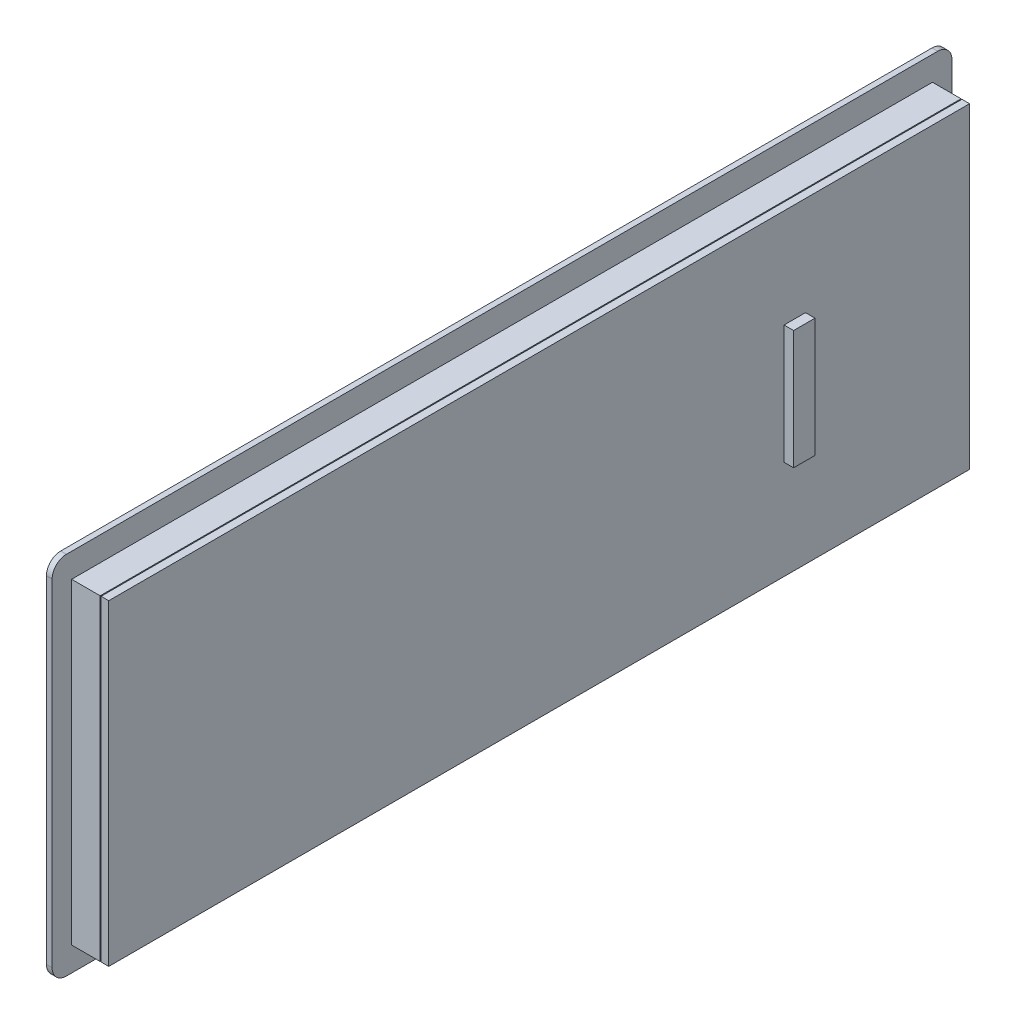
ISO-10303-21;
HEADER;
FILE_DESCRIPTION(('STEP AP214'),'2;1');
FILE_NAME('part.step','',(''),(''),'','','');
FILE_SCHEMA(('AUTOMOTIVE_DESIGN { 1 0 10303 214 1 1 1 1 }'));
ENDSEC;
DATA;
#1=APPLICATION_CONTEXT('core data for automotive mechanical design processes');
#2=APPLICATION_PROTOCOL_DEFINITION('international standard','automotive_design',2000,#1);
#3=PRODUCT_CONTEXT('',#1,'mechanical');
#4=PRODUCT('Part','Part','',(#3));
#5=PRODUCT_RELATED_PRODUCT_CATEGORY('part','',(#4));
#6=PRODUCT_DEFINITION_FORMATION('','',#4);
#7=PRODUCT_DEFINITION_CONTEXT('part definition',#1,'design');
#8=PRODUCT_DEFINITION('design','',#6,#7);
#9=PRODUCT_DEFINITION_SHAPE('','',#8);
#10=(LENGTH_UNIT() NAMED_UNIT(*) SI_UNIT(.MILLI.,.METRE.));
#11=(NAMED_UNIT(*) PLANE_ANGLE_UNIT() SI_UNIT($,.RADIAN.));
#12=(NAMED_UNIT(*) SI_UNIT($,.STERADIAN.) SOLID_ANGLE_UNIT());
#13=UNCERTAINTY_MEASURE_WITH_UNIT(LENGTH_MEASURE(1.E-05),#10,'distance_accuracy_value','');
#14=(GEOMETRIC_REPRESENTATION_CONTEXT(3) GLOBAL_UNCERTAINTY_ASSIGNED_CONTEXT((#13)) GLOBAL_UNIT_ASSIGNED_CONTEXT((#10,
#11,#12)) REPRESENTATION_CONTEXT('',''));
#15=CARTESIAN_POINT('',(0.,0.,0.));
#16=DIRECTION('',(0.,0.,1.));
#17=DIRECTION('',(1.,0.,0.));
#18=AXIS2_PLACEMENT_3D('',#15,#16,#17);
#19=CARTESIAN_POINT('',(9.,0.,0.));
#20=DIRECTION('',(1.,0.,0.));
#21=DIRECTION('',(0.,0.,-1.));
#22=AXIS2_PLACEMENT_3D('',#19,#20,#21);
#23=PLANE('',#22);
#24=DIRECTION('',(0.,-1.,0.));
#25=VECTOR('',#24,1.);
#26=CARTESIAN_POINT('',(9.,33.3,90.4999999999999));
#27=LINE('',#26,#25);
#28=CARTESIAN_POINT('',(9.,33.3,90.4999999999999));
#29=VERTEX_POINT('',#28);
#30=CARTESIAN_POINT('',(9.,-33.3,90.4999999999999));
#31=VERTEX_POINT('',#30);
#32=EDGE_CURVE('E287',#29,#31,#27,.T.);
#33=ORIENTED_EDGE('',*,*,#32,.T.);
#34=DIRECTION('',(0.,0.,-1.));
#35=VECTOR('',#34,1.);
#36=CARTESIAN_POINT('',(9.,-33.3,90.4999999999999));
#37=LINE('',#36,#35);
#38=CARTESIAN_POINT('',(9.,-33.3,-90.5));
#39=VERTEX_POINT('',#38);
#40=EDGE_CURVE('E290',#31,#39,#37,.T.);
#41=ORIENTED_EDGE('',*,*,#40,.T.);
#42=DIRECTION('',(0.,1.,0.));
#43=VECTOR('',#42,1.);
#44=CARTESIAN_POINT('',(9.,33.3,-90.5));
#45=LINE('',#44,#43);
#46=CARTESIAN_POINT('',(9.,33.3,-90.5));
#47=VERTEX_POINT('',#46);
#48=EDGE_CURVE('E293',#39,#47,#45,.T.);
#49=ORIENTED_EDGE('',*,*,#48,.T.);
#50=DIRECTION('',(0.,0.,1.));
#51=VECTOR('',#50,1.);
#52=CARTESIAN_POINT('',(9.,33.3,90.4999999999999));
#53=LINE('',#52,#51);
#54=EDGE_CURVE('E295',#47,#29,#53,.T.);
#55=ORIENTED_EDGE('',*,*,#54,.T.);
#56=EDGE_LOOP('',(#33,#41,#49,#55));
#57=FACE_BOUND('',#56,.T.);
#58=DIRECTION('',(0.,0.,-1.));
#59=VECTOR('',#58,1.);
#60=CARTESIAN_POINT('',(9.,-12.5,-51.5));
#61=LINE('',#60,#59);
#62=CARTESIAN_POINT('',(9.,-12.5,-51.5));
#63=VERTEX_POINT('',#62);
#64=CARTESIAN_POINT('',(9.,-12.5,-56.));
#65=VERTEX_POINT('',#64);
#66=EDGE_CURVE('E970',#63,#65,#61,.T.);
#67=ORIENTED_EDGE('',*,*,#66,.F.);
#68=DIRECTION('',(0.,-1.,0.));
#69=VECTOR('',#68,1.);
#70=CARTESIAN_POINT('',(9.,12.5,-51.5));
#71=LINE('',#70,#69);
#72=CARTESIAN_POINT('',(9.,12.5,-51.5));
#73=VERTEX_POINT('',#72);
#74=EDGE_CURVE('E250',#73,#63,#71,.T.);
#75=ORIENTED_EDGE('',*,*,#74,.F.);
#76=DIRECTION('',(0.,0.,1.));
#77=VECTOR('',#76,1.);
#78=CARTESIAN_POINT('',(9.,12.5,-51.5));
#79=LINE('',#78,#77);
#80=CARTESIAN_POINT('',(9.,12.5,-56.));
#81=VERTEX_POINT('',#80);
#82=EDGE_CURVE('E246',#81,#73,#79,.T.);
#83=ORIENTED_EDGE('',*,*,#82,.F.);
#84=DIRECTION('',(0.,1.,0.));
#85=VECTOR('',#84,1.);
#86=CARTESIAN_POINT('',(9.,12.5,-56.));
#87=LINE('',#86,#85);
#88=EDGE_CURVE('E967',#65,#81,#87,.T.);
#89=ORIENTED_EDGE('',*,*,#88,.F.);
#90=EDGE_LOOP('',(#67,#75,#83,#89));
#91=FACE_BOUND('',#90,.T.);
#92=ADVANCED_FACE('F42',(#57,#91),#23,.T.);
#93=CARTESIAN_POINT('',(1.2,35.4,91.6));
#94=DIRECTION('',(-1.,0.,0.));
#95=DIRECTION('',(0.,0.,1.));
#96=AXIS2_PLACEMENT_3D('',#93,#94,#95);
#97=CYLINDRICAL_SURFACE('',#96,3.);
#98=CARTESIAN_POINT('',(0.,35.4,91.6));
#99=DIRECTION('',(1.,0.,0.));
#100=DIRECTION('',(0.,0.,-1.));
#101=AXIS2_PLACEMENT_3D('',#98,#99,#100);
#102=CIRCLE('',#101,3.);
#103=CARTESIAN_POINT('',(0.,38.4,91.5999999999999));
#104=VERTEX_POINT('',#103);
#105=CARTESIAN_POINT('',(0.,35.3999999999999,94.6));
#106=VERTEX_POINT('',#105);
#107=EDGE_CURVE('E385',#104,#106,#102,.T.);
#108=ORIENTED_EDGE('',*,*,#107,.T.);
#109=DIRECTION('',(-1.,0.,0.));
#110=VECTOR('',#109,1.);
#111=CARTESIAN_POINT('',(1.2,35.3999999999999,94.6));
#112=LINE('',#111,#110);
#113=CARTESIAN_POINT('',(1.2,35.3999999999999,94.6));
#114=VERTEX_POINT('',#113);
#115=EDGE_CURVE('E11',#114,#106,#112,.T.);
#116=ORIENTED_EDGE('',*,*,#115,.F.);
#117=CARTESIAN_POINT('',(1.2,35.4,91.6));
#118=DIRECTION('',(1.,0.,0.));
#119=DIRECTION('',(0.,0.,-1.));
#120=AXIS2_PLACEMENT_3D('',#117,#118,#119);
#121=CIRCLE('',#120,3.);
#122=CARTESIAN_POINT('',(1.2,38.4,91.5999999999999));
#123=VERTEX_POINT('',#122);
#124=EDGE_CURVE('E386',#123,#114,#121,.T.);
#125=ORIENTED_EDGE('',*,*,#124,.F.);
#126=DIRECTION('',(-1.,0.,0.));
#127=VECTOR('',#126,1.);
#128=CARTESIAN_POINT('',(1.2,38.4,91.5999999999999));
#129=LINE('',#128,#127);
#130=EDGE_CURVE('E404',#123,#104,#129,.T.);
#131=ORIENTED_EDGE('',*,*,#130,.T.);
#132=EDGE_LOOP('',(#108,#116,#125,#131));
#133=FACE_BOUND('',#132,.T.);
#134=ADVANCED_FACE('F44',(#133),#97,.T.);
#135=CARTESIAN_POINT('',(1.2,-35.4,94.6));
#136=DIRECTION('',(0.,0.,-1.));
#137=DIRECTION('',(0.,1.,0.));
#138=AXIS2_PLACEMENT_3D('',#135,#136,#137);
#139=PLANE('',#138);
#140=DIRECTION('',(0.,-1.,0.));
#141=VECTOR('',#140,1.);
#142=CARTESIAN_POINT('',(0.,-35.4,94.6));
#143=LINE('',#142,#141);
#144=CARTESIAN_POINT('',(0.,-35.4,94.6));
#145=VERTEX_POINT('',#144);
#146=EDGE_CURVE('E407',#106,#145,#143,.T.);
#147=ORIENTED_EDGE('',*,*,#146,.T.);
#148=DIRECTION('',(-1.,0.,0.));
#149=VECTOR('',#148,1.);
#150=CARTESIAN_POINT('',(1.2,-35.4,94.6));
#151=LINE('',#150,#149);
#152=CARTESIAN_POINT('',(1.2,-35.4,94.6));
#153=VERTEX_POINT('',#152);
#154=EDGE_CURVE('E50',#153,#145,#151,.T.);
#155=ORIENTED_EDGE('',*,*,#154,.F.);
#156=DIRECTION('',(0.,-1.,0.));
#157=VECTOR('',#156,1.);
#158=CARTESIAN_POINT('',(1.2,-35.4,94.6));
#159=LINE('',#158,#157);
#160=EDGE_CURVE('E389',#114,#153,#159,.T.);
#161=ORIENTED_EDGE('',*,*,#160,.F.);
#162=ORIENTED_EDGE('',*,*,#115,.T.);
#163=EDGE_LOOP('',(#147,#155,#161,#162));
#164=FACE_BOUND('',#163,.T.);
#165=ADVANCED_FACE('F464',(#164),#139,.F.);
#166=CARTESIAN_POINT('',(1.2,-35.4,91.6));
#167=DIRECTION('',(-1.,0.,0.));
#168=DIRECTION('',(0.,0.,1.));
#169=AXIS2_PLACEMENT_3D('',#166,#167,#168);
#170=CYLINDRICAL_SURFACE('',#169,3.);
#171=CARTESIAN_POINT('',(0.,-35.4,91.6));
#172=DIRECTION('',(1.,0.,0.));
#173=DIRECTION('',(0.,0.,1.));
#174=AXIS2_PLACEMENT_3D('',#171,#172,#173);
#175=CIRCLE('',#174,3.);
#176=CARTESIAN_POINT('',(0.,-38.4,91.6));
#177=VERTEX_POINT('',#176);
#178=EDGE_CURVE('E409',#145,#177,#175,.T.);
#179=ORIENTED_EDGE('',*,*,#178,.T.);
#180=DIRECTION('',(-1.,0.,0.));
#181=VECTOR('',#180,1.);
#182=CARTESIAN_POINT('',(1.2,-38.4,91.6));
#183=LINE('',#182,#181);
#184=CARTESIAN_POINT('',(1.2,-38.4,91.6));
#185=VERTEX_POINT('',#184);
#186=EDGE_CURVE('E434',#185,#177,#183,.T.);
#187=ORIENTED_EDGE('',*,*,#186,.F.);
#188=CARTESIAN_POINT('',(1.2,-35.4,91.6));
#189=DIRECTION('',(1.,0.,0.));
#190=DIRECTION('',(0.,0.,1.));
#191=AXIS2_PLACEMENT_3D('',#188,#189,#190);
#192=CIRCLE('',#191,3.);
#193=EDGE_CURVE('E392',#153,#185,#192,.T.);
#194=ORIENTED_EDGE('',*,*,#193,.F.);
#195=ORIENTED_EDGE('',*,*,#154,.T.);
#196=EDGE_LOOP('',(#179,#187,#194,#195));
#197=FACE_BOUND('',#196,.T.);
#198=ADVANCED_FACE('F441',(#197),#170,.T.);
#199=CARTESIAN_POINT('',(1.2,-38.4,-91.6));
#200=DIRECTION('',(0.,1.,0.));
#201=DIRECTION('',(0.,0.,1.));
#202=AXIS2_PLACEMENT_3D('',#199,#200,#201);
#203=PLANE('',#202);
#204=DIRECTION('',(0.,0.,-1.));
#205=VECTOR('',#204,1.);
#206=CARTESIAN_POINT('',(0.,-38.4,-91.6));
#207=LINE('',#206,#205);
#208=CARTESIAN_POINT('',(0.,-38.4,-91.6));
#209=VERTEX_POINT('',#208);
#210=EDGE_CURVE('E411',#177,#209,#207,.T.);
#211=ORIENTED_EDGE('',*,*,#210,.T.);
#212=DIRECTION('',(-1.,0.,0.));
#213=VECTOR('',#212,1.);
#214=CARTESIAN_POINT('',(1.2,-38.4,-91.6));
#215=LINE('',#214,#213);
#216=CARTESIAN_POINT('',(1.2,-38.4,-91.6));
#217=VERTEX_POINT('',#216);
#218=EDGE_CURVE('E431',#217,#209,#215,.T.);
#219=ORIENTED_EDGE('',*,*,#218,.F.);
#220=DIRECTION('',(0.,0.,-1.));
#221=VECTOR('',#220,1.);
#222=CARTESIAN_POINT('',(1.2,-38.4,-91.6));
#223=LINE('',#222,#221);
#224=EDGE_CURVE('E394',#185,#217,#223,.T.);
#225=ORIENTED_EDGE('',*,*,#224,.F.);
#226=ORIENTED_EDGE('',*,*,#186,.T.);
#227=EDGE_LOOP('',(#211,#219,#225,#226));
#228=FACE_BOUND('',#227,.T.);
#229=ADVANCED_FACE('F452',(#228),#203,.F.);
#230=CARTESIAN_POINT('',(1.2,-35.4,-91.6));
#231=DIRECTION('',(-1.,0.,0.));
#232=DIRECTION('',(0.,0.,1.));
#233=AXIS2_PLACEMENT_3D('',#230,#231,#232);
#234=CYLINDRICAL_SURFACE('',#233,3.);
#235=CARTESIAN_POINT('',(0.,-35.4,-91.6));
#236=DIRECTION('',(1.,0.,0.));
#237=DIRECTION('',(0.,0.,-1.));
#238=AXIS2_PLACEMENT_3D('',#235,#236,#237);
#239=CIRCLE('',#238,3.);
#240=CARTESIAN_POINT('',(0.,-35.4,-94.6));
#241=VERTEX_POINT('',#240);
#242=EDGE_CURVE('E413',#209,#241,#239,.T.);
#243=ORIENTED_EDGE('',*,*,#242,.T.);
#244=DIRECTION('',(-1.,0.,0.));
#245=VECTOR('',#244,1.);
#246=CARTESIAN_POINT('',(1.2,-35.4,-94.6));
#247=LINE('',#246,#245);
#248=CARTESIAN_POINT('',(1.2,-35.4,-94.6));
#249=VERTEX_POINT('',#248);
#250=EDGE_CURVE('E428',#249,#241,#247,.T.);
#251=ORIENTED_EDGE('',*,*,#250,.F.);
#252=CARTESIAN_POINT('',(1.2,-35.4,-91.6));
#253=DIRECTION('',(1.,0.,0.));
#254=DIRECTION('',(0.,0.,-1.));
#255=AXIS2_PLACEMENT_3D('',#252,#253,#254);
#256=CIRCLE('',#255,3.);
#257=EDGE_CURVE('E396',#217,#249,#256,.T.);
#258=ORIENTED_EDGE('',*,*,#257,.F.);
#259=ORIENTED_EDGE('',*,*,#218,.T.);
#260=EDGE_LOOP('',(#243,#251,#258,#259));
#261=FACE_BOUND('',#260,.T.);
#262=ADVANCED_FACE('F456',(#261),#234,.T.);
#263=CARTESIAN_POINT('',(1.2,-35.4,-94.6));
#264=DIRECTION('',(0.,0.,1.));
#265=DIRECTION('',(1.,0.,0.));
#266=AXIS2_PLACEMENT_3D('',#263,#264,#265);
#267=PLANE('',#266);
#268=DIRECTION('',(0.,1.,0.));
#269=VECTOR('',#268,1.);
#270=CARTESIAN_POINT('',(0.,-35.4,-94.6));
#271=LINE('',#270,#269);
#272=CARTESIAN_POINT('',(0.,35.4,-94.6));
#273=VERTEX_POINT('',#272);
#274=EDGE_CURVE('E415',#241,#273,#271,.T.);
#275=ORIENTED_EDGE('',*,*,#274,.T.);
#276=DIRECTION('',(-1.,0.,0.));
#277=VECTOR('',#276,1.);
#278=CARTESIAN_POINT('',(1.2,35.4,-94.6));
#279=LINE('',#278,#277);
#280=CARTESIAN_POINT('',(1.2,35.4,-94.6));
#281=VERTEX_POINT('',#280);
#282=EDGE_CURVE('E425',#281,#273,#279,.T.);
#283=ORIENTED_EDGE('',*,*,#282,.F.);
#284=DIRECTION('',(0.,1.,0.));
#285=VECTOR('',#284,1.);
#286=CARTESIAN_POINT('',(1.2,-35.4,-94.6));
#287=LINE('',#286,#285);
#288=EDGE_CURVE('E398',#249,#281,#287,.T.);
#289=ORIENTED_EDGE('',*,*,#288,.F.);
#290=ORIENTED_EDGE('',*,*,#250,.T.);
#291=EDGE_LOOP('',(#275,#283,#289,#290));
#292=FACE_BOUND('',#291,.T.);
#293=ADVANCED_FACE('F477',(#292),#267,.F.);
#294=CARTESIAN_POINT('',(1.2,35.4,-91.6));
#295=DIRECTION('',(-1.,0.,0.));
#296=DIRECTION('',(0.,0.,1.));
#297=AXIS2_PLACEMENT_3D('',#294,#295,#296);
#298=CYLINDRICAL_SURFACE('',#297,3.);
#299=CARTESIAN_POINT('',(0.,35.4,-91.6));
#300=DIRECTION('',(1.,0.,0.));
#301=DIRECTION('',(0.,0.,-1.));
#302=AXIS2_PLACEMENT_3D('',#299,#300,#301);
#303=CIRCLE('',#302,3.);
#304=CARTESIAN_POINT('',(0.,38.4,-91.6));
#305=VERTEX_POINT('',#304);
#306=EDGE_CURVE('E417',#273,#305,#303,.T.);
#307=ORIENTED_EDGE('',*,*,#306,.T.);
#308=DIRECTION('',(-1.,0.,0.));
#309=VECTOR('',#308,1.);
#310=CARTESIAN_POINT('',(1.2,38.4,-91.6));
#311=LINE('',#310,#309);
#312=CARTESIAN_POINT('',(1.2,38.4,-91.6));
#313=VERTEX_POINT('',#312);
#314=EDGE_CURVE('E422',#313,#305,#311,.T.);
#315=ORIENTED_EDGE('',*,*,#314,.F.);
#316=CARTESIAN_POINT('',(1.2,35.4,-91.6));
#317=DIRECTION('',(1.,0.,0.));
#318=DIRECTION('',(0.,0.,-1.));
#319=AXIS2_PLACEMENT_3D('',#316,#317,#318);
#320=CIRCLE('',#319,3.);
#321=EDGE_CURVE('E400',#281,#313,#320,.T.);
#322=ORIENTED_EDGE('',*,*,#321,.F.);
#323=ORIENTED_EDGE('',*,*,#282,.T.);
#324=EDGE_LOOP('',(#307,#315,#322,#323));
#325=FACE_BOUND('',#324,.T.);
#326=ADVANCED_FACE('F475',(#325),#298,.T.);
#327=CARTESIAN_POINT('',(1.2,38.4,-91.6));
#328=DIRECTION('',(0.,-1.,0.));
#329=DIRECTION('',(0.,0.,-1.));
#330=AXIS2_PLACEMENT_3D('',#327,#328,#329);
#331=PLANE('',#330);
#332=DIRECTION('',(0.,0.,1.));
#333=VECTOR('',#332,1.);
#334=CARTESIAN_POINT('',(0.,38.4,-91.6));
#335=LINE('',#334,#333);
#336=EDGE_CURVE('E390',#305,#104,#335,.T.);
#337=ORIENTED_EDGE('',*,*,#336,.T.);
#338=ORIENTED_EDGE('',*,*,#130,.F.);
#339=DIRECTION('',(0.,0.,1.));
#340=VECTOR('',#339,1.);
#341=CARTESIAN_POINT('',(1.2,38.4,-91.6));
#342=LINE('',#341,#340);
#343=EDGE_CURVE('E402',#313,#123,#342,.T.);
#344=ORIENTED_EDGE('',*,*,#343,.F.);
#345=ORIENTED_EDGE('',*,*,#314,.T.);
#346=EDGE_LOOP('',(#337,#338,#344,#345));
#347=FACE_BOUND('',#346,.T.);
#348=ADVANCED_FACE('F470',(#347),#331,.F.);
#349=CARTESIAN_POINT('',(1.2,35.4,91.6));
#350=DIRECTION('',(1.,0.,0.));
#351=DIRECTION('',(0.,0.,-1.));
#352=AXIS2_PLACEMENT_3D('',#349,#350,#351);
#353=PLANE('',#352);
#354=DIRECTION('',(0.,-1.,0.));
#355=VECTOR('',#354,1.);
#356=CARTESIAN_POINT('',(1.2,33.3,90.4999999999999));
#357=LINE('',#356,#355);
#358=CARTESIAN_POINT('',(1.2,33.3,90.4999999999999));
#359=VERTEX_POINT('',#358);
#360=CARTESIAN_POINT('',(1.2,-33.3,90.4999999999999));
#361=VERTEX_POINT('',#360);
#362=EDGE_CURVE('E352',#359,#361,#357,.T.);
#363=ORIENTED_EDGE('',*,*,#362,.F.);
#364=DIRECTION('',(0.,0.,1.));
#365=VECTOR('',#364,1.);
#366=CARTESIAN_POINT('',(1.2,33.3,90.4999999999999));
#367=LINE('',#366,#365);
#368=CARTESIAN_POINT('',(1.2,33.3,-90.5));
#369=VERTEX_POINT('',#368);
#370=EDGE_CURVE('E357',#369,#359,#367,.T.);
#371=ORIENTED_EDGE('',*,*,#370,.F.);
#372=DIRECTION('',(0.,1.,0.));
#373=VECTOR('',#372,1.);
#374=CARTESIAN_POINT('',(1.2,33.3,-90.5));
#375=LINE('',#374,#373);
#376=CARTESIAN_POINT('',(1.2,-33.3,-90.5));
#377=VERTEX_POINT('',#376);
#378=EDGE_CURVE('E369',#377,#369,#375,.T.);
#379=ORIENTED_EDGE('',*,*,#378,.F.);
#380=DIRECTION('',(0.,0.,-1.));
#381=VECTOR('',#380,1.);
#382=CARTESIAN_POINT('',(1.2,-33.3,90.4999999999999));
#383=LINE('',#382,#381);
#384=EDGE_CURVE('E366',#361,#377,#383,.T.);
#385=ORIENTED_EDGE('',*,*,#384,.F.);
#386=EDGE_LOOP('',(#363,#371,#379,#385));
#387=FACE_BOUND('',#386,.T.);
#388=ORIENTED_EDGE('',*,*,#124,.T.);
#389=ORIENTED_EDGE('',*,*,#160,.T.);
#390=ORIENTED_EDGE('',*,*,#193,.T.);
#391=ORIENTED_EDGE('',*,*,#224,.T.);
#392=ORIENTED_EDGE('',*,*,#257,.T.);
#393=ORIENTED_EDGE('',*,*,#288,.T.);
#394=ORIENTED_EDGE('',*,*,#321,.T.);
#395=ORIENTED_EDGE('',*,*,#343,.T.);
#396=EDGE_LOOP('',(#388,#389,#390,#391,#392,#393,#394,#395));
#397=FACE_BOUND('',#396,.T.);
#398=ADVANCED_FACE('F460',(#387,#397),#353,.T.);
#399=CARTESIAN_POINT('',(0.,35.4,91.6));
#400=DIRECTION('',(1.,0.,0.));
#401=DIRECTION('',(0.,0.,-1.));
#402=AXIS2_PLACEMENT_3D('',#399,#400,#401);
#403=PLANE('',#402);
#404=DIRECTION('',(0.,0.,1.));
#405=VECTOR('',#404,1.);
#406=CARTESIAN_POINT('',(0.,-30.51,-80.7));
#407=LINE('',#406,#405);
#408=CARTESIAN_POINT('',(0.,-30.51,-80.7));
#409=VERTEX_POINT('',#408);
#410=CARTESIAN_POINT('',(0.,-30.51,80.7));
#411=VERTEX_POINT('',#410);
#412=EDGE_CURVE('E253',#409,#411,#407,.T.);
#413=ORIENTED_EDGE('',*,*,#412,.F.);
#414=DIRECTION('',(0.,-1.,0.));
#415=VECTOR('',#414,1.);
#416=CARTESIAN_POINT('',(0.,30.51,-80.7));
#417=LINE('',#416,#415);
#418=CARTESIAN_POINT('',(0.,30.51,-80.7));
#419=VERTEX_POINT('',#418);
#420=EDGE_CURVE('E65',#419,#409,#417,.T.);
#421=ORIENTED_EDGE('',*,*,#420,.F.);
#422=DIRECTION('',(0.,0.,-1.));
#423=VECTOR('',#422,1.);
#424=CARTESIAN_POINT('',(0.,30.51,-80.7));
#425=LINE('',#424,#423);
#426=CARTESIAN_POINT('',(0.,30.51,80.6999999999999));
#427=VERTEX_POINT('',#426);
#428=EDGE_CURVE('E262',#427,#419,#425,.T.);
#429=ORIENTED_EDGE('',*,*,#428,.F.);
#430=DIRECTION('',(0.,1.,0.));
#431=VECTOR('',#430,1.);
#432=CARTESIAN_POINT('',(0.,30.51,80.6999999999999));
#433=LINE('',#432,#431);
#434=EDGE_CURVE('E274',#411,#427,#433,.T.);
#435=ORIENTED_EDGE('',*,*,#434,.F.);
#436=EDGE_LOOP('',(#413,#421,#429,#435));
#437=FACE_BOUND('',#436,.T.);
#438=ORIENTED_EDGE('',*,*,#107,.F.);
#439=ORIENTED_EDGE('',*,*,#336,.F.);
#440=ORIENTED_EDGE('',*,*,#306,.F.);
#441=ORIENTED_EDGE('',*,*,#274,.F.);
#442=ORIENTED_EDGE('',*,*,#242,.F.);
#443=ORIENTED_EDGE('',*,*,#210,.F.);
#444=ORIENTED_EDGE('',*,*,#178,.F.);
#445=ORIENTED_EDGE('',*,*,#146,.F.);
#446=EDGE_LOOP('',(#438,#439,#440,#441,#442,#443,#444,#445));
#447=FACE_BOUND('',#446,.T.);
#448=ADVANCED_FACE('F447',(#437,#447),#403,.F.);
#449=CARTESIAN_POINT('',(7.2,33.3,90.4999999999999));
#450=DIRECTION('',(0.,0.,-1.));
#451=DIRECTION('',(0.,1.,0.));
#452=AXIS2_PLACEMENT_3D('',#449,#450,#451);
#453=PLANE('',#452);
#454=ORIENTED_EDGE('',*,*,#362,.T.);
#455=DIRECTION('',(-1.,0.,0.));
#456=VECTOR('',#455,1.);
#457=CARTESIAN_POINT('',(7.2,-33.3,90.4999999999999));
#458=LINE('',#457,#456);
#459=CARTESIAN_POINT('',(7.2,-33.3,90.4999999999999));
#460=VERTEX_POINT('',#459);
#461=EDGE_CURVE('E382',#460,#361,#458,.T.);
#462=ORIENTED_EDGE('',*,*,#461,.F.);
#463=DIRECTION('',(0.,-1.,0.));
#464=VECTOR('',#463,1.);
#465=CARTESIAN_POINT('',(7.2,33.3,90.4999999999999));
#466=LINE('',#465,#464);
#467=CARTESIAN_POINT('',(7.2,33.3,90.4999999999999));
#468=VERTEX_POINT('',#467);
#469=EDGE_CURVE('E353',#468,#460,#466,.T.);
#470=ORIENTED_EDGE('',*,*,#469,.F.);
#471=DIRECTION('',(-1.,0.,0.));
#472=VECTOR('',#471,1.);
#473=CARTESIAN_POINT('',(7.2,33.3,90.4999999999999));
#474=LINE('',#473,#472);
#475=EDGE_CURVE('E363',#468,#359,#474,.T.);
#476=ORIENTED_EDGE('',*,*,#475,.T.);
#477=EDGE_LOOP('',(#454,#462,#470,#476));
#478=FACE_BOUND('',#477,.T.);
#479=ADVANCED_FACE('F548',(#478),#453,.F.);
#480=CARTESIAN_POINT('',(7.2,-33.3,90.4999999999999));
#481=DIRECTION('',(0.,1.,0.));
#482=DIRECTION('',(0.,0.,1.));
#483=AXIS2_PLACEMENT_3D('',#480,#481,#482);
#484=PLANE('',#483);
#485=ORIENTED_EDGE('',*,*,#384,.T.);
#486=DIRECTION('',(-1.,0.,0.));
#487=VECTOR('',#486,1.);
#488=CARTESIAN_POINT('',(7.2,-33.3,-90.5));
#489=LINE('',#488,#487);
#490=CARTESIAN_POINT('',(7.2,-33.3,-90.5));
#491=VERTEX_POINT('',#490);
#492=EDGE_CURVE('E379',#491,#377,#489,.T.);
#493=ORIENTED_EDGE('',*,*,#492,.F.);
#494=DIRECTION('',(0.,0.,-1.));
#495=VECTOR('',#494,1.);
#496=CARTESIAN_POINT('',(7.2,-33.3,90.4999999999999));
#497=LINE('',#496,#495);
#498=EDGE_CURVE('E356',#460,#491,#497,.T.);
#499=ORIENTED_EDGE('',*,*,#498,.F.);
#500=ORIENTED_EDGE('',*,*,#461,.T.);
#501=EDGE_LOOP('',(#485,#493,#499,#500));
#502=FACE_BOUND('',#501,.T.);
#503=ADVANCED_FACE('F544',(#502),#484,.F.);
#504=CARTESIAN_POINT('',(7.2,33.3,-90.5));
#505=DIRECTION('',(0.,0.,1.));
#506=DIRECTION('',(0.,-1.,0.));
#507=AXIS2_PLACEMENT_3D('',#504,#505,#506);
#508=PLANE('',#507);
#509=ORIENTED_EDGE('',*,*,#378,.T.);
#510=DIRECTION('',(-1.,0.,0.));
#511=VECTOR('',#510,1.);
#512=CARTESIAN_POINT('',(7.2,33.3,-90.5));
#513=LINE('',#512,#511);
#514=CARTESIAN_POINT('',(7.2,33.3,-90.5));
#515=VERTEX_POINT('',#514);
#516=EDGE_CURVE('E376',#515,#369,#513,.T.);
#517=ORIENTED_EDGE('',*,*,#516,.F.);
#518=DIRECTION('',(0.,1.,0.));
#519=VECTOR('',#518,1.);
#520=CARTESIAN_POINT('',(7.2,33.3,-90.5));
#521=LINE('',#520,#519);
#522=EDGE_CURVE('E359',#491,#515,#521,.T.);
#523=ORIENTED_EDGE('',*,*,#522,.F.);
#524=ORIENTED_EDGE('',*,*,#492,.T.);
#525=EDGE_LOOP('',(#509,#517,#523,#524));
#526=FACE_BOUND('',#525,.T.);
#527=ADVANCED_FACE('F540',(#526),#508,.F.);
#528=CARTESIAN_POINT('',(7.2,33.3,90.4999999999999));
#529=DIRECTION('',(0.,-1.,0.));
#530=DIRECTION('',(0.,0.,-1.));
#531=AXIS2_PLACEMENT_3D('',#528,#529,#530);
#532=PLANE('',#531);
#533=ORIENTED_EDGE('',*,*,#370,.T.);
#534=ORIENTED_EDGE('',*,*,#475,.F.);
#535=DIRECTION('',(0.,0.,1.));
#536=VECTOR('',#535,1.);
#537=CARTESIAN_POINT('',(7.2,33.3,90.4999999999999));
#538=LINE('',#537,#536);
#539=EDGE_CURVE('E361',#515,#468,#538,.T.);
#540=ORIENTED_EDGE('',*,*,#539,.F.);
#541=ORIENTED_EDGE('',*,*,#516,.T.);
#542=EDGE_LOOP('',(#533,#534,#540,#541));
#543=FACE_BOUND('',#542,.T.);
#544=ADVANCED_FACE('F536',(#543),#532,.F.);
#545=CARTESIAN_POINT('',(7.2,0.,0.));
#546=DIRECTION('',(1.,0.,0.));
#547=DIRECTION('',(0.,0.,-1.));
#548=AXIS2_PLACEMENT_3D('',#545,#546,#547);
#549=PLANE('',#548);
#550=DIRECTION('',(0.,-1.,0.));
#551=VECTOR('',#550,1.);
#552=CARTESIAN_POINT('',(7.2,30.7998921727304,87.5388419430578));
#553=LINE('',#552,#551);
#554=CARTESIAN_POINT('',(7.2,30.7998921727304,87.5388419430578));
#555=VERTEX_POINT('',#554);
#556=CARTESIAN_POINT('',(7.2,-31.3407820481366,87.5388419430578));
#557=VERTEX_POINT('',#556);
#558=EDGE_CURVE('E316',#555,#557,#553,.T.);
#559=ORIENTED_EDGE('',*,*,#558,.F.);
#560=DIRECTION('',(0.,0.,1.));
#561=VECTOR('',#560,1.);
#562=CARTESIAN_POINT('',(7.2,30.7998921727304,87.5388419430578));
#563=LINE('',#562,#561);
#564=CARTESIAN_POINT('',(7.2,30.7998921727304,-88.4139327939693));
#565=VERTEX_POINT('',#564);
#566=EDGE_CURVE('E321',#565,#555,#563,.T.);
#567=ORIENTED_EDGE('',*,*,#566,.F.);
#568=DIRECTION('',(0.,1.,0.));
#569=VECTOR('',#568,1.);
#570=CARTESIAN_POINT('',(7.2,30.7998921727304,-88.4139327939693));
#571=LINE('',#570,#569);
#572=CARTESIAN_POINT('',(7.2,-31.3407820481366,-88.4139327939693));
#573=VERTEX_POINT('',#572);
#574=EDGE_CURVE('E336',#573,#565,#571,.T.);
#575=ORIENTED_EDGE('',*,*,#574,.F.);
#576=DIRECTION('',(0.,0.,-1.));
#577=VECTOR('',#576,1.);
#578=CARTESIAN_POINT('',(7.2,-31.3407820481366,87.5388419430578));
#579=LINE('',#578,#577);
#580=EDGE_CURVE('E333',#557,#573,#579,.T.);
#581=ORIENTED_EDGE('',*,*,#580,.F.);
#582=EDGE_LOOP('',(#559,#567,#575,#581));
#583=FACE_BOUND('',#582,.T.);
#584=ORIENTED_EDGE('',*,*,#469,.T.);
#585=ORIENTED_EDGE('',*,*,#498,.T.);
#586=ORIENTED_EDGE('',*,*,#522,.T.);
#587=ORIENTED_EDGE('',*,*,#539,.T.);
#588=EDGE_LOOP('',(#584,#585,#586,#587));
#589=FACE_BOUND('',#588,.T.);
#590=ADVANCED_FACE('F532',(#583,#589),#549,.T.);
#591=CARTESIAN_POINT('',(7.4,30.7998921727304,87.5388419430578));
#592=DIRECTION('',(0.,0.,-1.));
#593=DIRECTION('',(-1.,0.,0.));
#594=AXIS2_PLACEMENT_3D('',#591,#592,#593);
#595=PLANE('',#594);
#596=ORIENTED_EDGE('',*,*,#558,.T.);
#597=DIRECTION('',(-1.,0.,0.));
#598=VECTOR('',#597,1.);
#599=CARTESIAN_POINT('',(7.4,-31.3407820481366,87.5388419430578));
#600=LINE('',#599,#598);
#601=CARTESIAN_POINT('',(7.4,-31.3407820481366,87.5388419430578));
#602=VERTEX_POINT('',#601);
#603=EDGE_CURVE('E349',#602,#557,#600,.T.);
#604=ORIENTED_EDGE('',*,*,#603,.F.);
#605=DIRECTION('',(0.,-1.,0.));
#606=VECTOR('',#605,1.);
#607=CARTESIAN_POINT('',(7.4,30.7998921727304,87.5388419430578));
#608=LINE('',#607,#606);
#609=CARTESIAN_POINT('',(7.4,30.7998921727304,87.5388419430578));
#610=VERTEX_POINT('',#609);
#611=EDGE_CURVE('E317',#610,#602,#608,.T.);
#612=ORIENTED_EDGE('',*,*,#611,.F.);
#613=DIRECTION('',(-1.,0.,0.));
#614=VECTOR('',#613,1.);
#615=CARTESIAN_POINT('',(7.4,30.7998921727304,87.5388419430578));
#616=LINE('',#615,#614);
#617=EDGE_CURVE('E330',#610,#555,#616,.T.);
#618=ORIENTED_EDGE('',*,*,#617,.T.);
#619=EDGE_LOOP('',(#596,#604,#612,#618));
#620=FACE_BOUND('',#619,.T.);
#621=ADVANCED_FACE('F528',(#620),#595,.F.);
#622=CARTESIAN_POINT('',(7.4,-31.3407820481366,87.5388419430578));
#623=DIRECTION('',(0.,1.,0.));
#624=DIRECTION('',(0.,0.,1.));
#625=AXIS2_PLACEMENT_3D('',#622,#623,#624);
#626=PLANE('',#625);
#627=ORIENTED_EDGE('',*,*,#580,.T.);
#628=DIRECTION('',(-1.,0.,0.));
#629=VECTOR('',#628,1.);
#630=CARTESIAN_POINT('',(7.4,-31.3407820481366,-88.4139327939693));
#631=LINE('',#630,#629);
#632=CARTESIAN_POINT('',(7.4,-31.3407820481366,-88.4139327939693));
#633=VERTEX_POINT('',#632);
#634=EDGE_CURVE('E346',#633,#573,#631,.T.);
#635=ORIENTED_EDGE('',*,*,#634,.F.);
#636=DIRECTION('',(0.,0.,-1.));
#637=VECTOR('',#636,1.);
#638=CARTESIAN_POINT('',(7.4,-31.3407820481366,87.5388419430578));
#639=LINE('',#638,#637);
#640=EDGE_CURVE('E320',#602,#633,#639,.T.);
#641=ORIENTED_EDGE('',*,*,#640,.F.);
#642=ORIENTED_EDGE('',*,*,#603,.T.);
#643=EDGE_LOOP('',(#627,#635,#641,#642));
#644=FACE_BOUND('',#643,.T.);
#645=ADVANCED_FACE('F524',(#644),#626,.F.);
#646=CARTESIAN_POINT('',(7.4,30.7998921727304,-88.4139327939693));
#647=DIRECTION('',(0.,0.,1.));
#648=DIRECTION('',(1.,0.,0.));
#649=AXIS2_PLACEMENT_3D('',#646,#647,#648);
#650=PLANE('',#649);
#651=ORIENTED_EDGE('',*,*,#574,.T.);
#652=DIRECTION('',(-1.,0.,0.));
#653=VECTOR('',#652,1.);
#654=CARTESIAN_POINT('',(7.4,30.7998921727304,-88.4139327939693));
#655=LINE('',#654,#653);
#656=CARTESIAN_POINT('',(7.4,30.7998921727304,-88.4139327939693));
#657=VERTEX_POINT('',#656);
#658=EDGE_CURVE('E343',#657,#565,#655,.T.);
#659=ORIENTED_EDGE('',*,*,#658,.F.);
#660=DIRECTION('',(0.,1.,0.));
#661=VECTOR('',#660,1.);
#662=CARTESIAN_POINT('',(7.4,30.7998921727304,-88.4139327939693));
#663=LINE('',#662,#661);
#664=EDGE_CURVE('E324',#633,#657,#663,.T.);
#665=ORIENTED_EDGE('',*,*,#664,.F.);
#666=ORIENTED_EDGE('',*,*,#634,.T.);
#667=EDGE_LOOP('',(#651,#659,#665,#666));
#668=FACE_BOUND('',#667,.T.);
#669=ADVANCED_FACE('F520',(#668),#650,.F.);
#670=CARTESIAN_POINT('',(7.4,30.7998921727304,87.5388419430578));
#671=DIRECTION('',(0.,-1.,0.));
#672=DIRECTION('',(0.,0.,-1.));
#673=AXIS2_PLACEMENT_3D('',#670,#671,#672);
#674=PLANE('',#673);
#675=ORIENTED_EDGE('',*,*,#566,.T.);
#676=ORIENTED_EDGE('',*,*,#617,.F.);
#677=DIRECTION('',(0.,0.,1.));
#678=VECTOR('',#677,1.);
#679=CARTESIAN_POINT('',(7.4,30.7998921727304,87.5388419430578));
#680=LINE('',#679,#678);
#681=EDGE_CURVE('E327',#657,#610,#680,.T.);
#682=ORIENTED_EDGE('',*,*,#681,.F.);
#683=ORIENTED_EDGE('',*,*,#658,.T.);
#684=EDGE_LOOP('',(#675,#676,#682,#683));
#685=FACE_BOUND('',#684,.T.);
#686=ADVANCED_FACE('F501',(#685),#674,.F.);
#687=CARTESIAN_POINT('',(7.4,0.,0.));
#688=DIRECTION('',(1.,0.,0.));
#689=DIRECTION('',(0.,0.,-1.));
#690=AXIS2_PLACEMENT_3D('',#687,#688,#689);
#691=PLANE('',#690);
#692=DIRECTION('',(0.,-1.,0.));
#693=VECTOR('',#692,1.);
#694=CARTESIAN_POINT('',(7.4,33.3,90.4999999999999));
#695=LINE('',#694,#693);
#696=CARTESIAN_POINT('',(7.4,33.3,90.4999999999999));
#697=VERTEX_POINT('',#696);
#698=CARTESIAN_POINT('',(7.4,-33.3,90.4999999999999));
#699=VERTEX_POINT('',#698);
#700=EDGE_CURVE('E281',#697,#699,#695,.T.);
#701=ORIENTED_EDGE('',*,*,#700,.F.);
#702=DIRECTION('',(0.,0.,1.));
#703=VECTOR('',#702,1.);
#704=CARTESIAN_POINT('',(7.4,33.3,90.4999999999999));
#705=LINE('',#704,#703);
#706=CARTESIAN_POINT('',(7.4,33.3,-90.5));
#707=VERTEX_POINT('',#706);
#708=EDGE_CURVE('E291',#707,#697,#705,.T.);
#709=ORIENTED_EDGE('',*,*,#708,.F.);
#710=DIRECTION('',(0.,1.,0.));
#711=VECTOR('',#710,1.);
#712=CARTESIAN_POINT('',(7.4,33.3,-90.5));
#713=LINE('',#712,#711);
#714=CARTESIAN_POINT('',(7.4,-33.3,-90.5));
#715=VERTEX_POINT('',#714);
#716=EDGE_CURVE('E302',#715,#707,#713,.T.);
#717=ORIENTED_EDGE('',*,*,#716,.F.);
#718=DIRECTION('',(0.,0.,-1.));
#719=VECTOR('',#718,1.);
#720=CARTESIAN_POINT('',(7.4,-33.3,90.4999999999999));
#721=LINE('',#720,#719);
#722=EDGE_CURVE('E300',#699,#715,#721,.T.);
#723=ORIENTED_EDGE('',*,*,#722,.F.);
#724=EDGE_LOOP('',(#701,#709,#717,#723));
#725=FACE_BOUND('',#724,.T.);
#726=ORIENTED_EDGE('',*,*,#681,.T.);
#727=ORIENTED_EDGE('',*,*,#611,.T.);
#728=ORIENTED_EDGE('',*,*,#640,.T.);
#729=ORIENTED_EDGE('',*,*,#664,.T.);
#730=EDGE_LOOP('',(#726,#727,#728,#729));
#731=FACE_BOUND('',#730,.T.);
#732=ADVANCED_FACE('F497',(#725,#731),#691,.F.);
#733=CARTESIAN_POINT('',(9.,33.3,90.4999999999999));
#734=DIRECTION('',(0.,0.,-1.));
#735=DIRECTION('',(-1.,0.,0.));
#736=AXIS2_PLACEMENT_3D('',#733,#734,#735);
#737=PLANE('',#736);
#738=ORIENTED_EDGE('',*,*,#700,.T.);
#739=DIRECTION('',(-1.,0.,0.));
#740=VECTOR('',#739,1.);
#741=CARTESIAN_POINT('',(9.,-33.3,90.4999999999999));
#742=LINE('',#741,#740);
#743=EDGE_CURVE('E313',#31,#699,#742,.T.);
#744=ORIENTED_EDGE('',*,*,#743,.F.);
#745=ORIENTED_EDGE('',*,*,#32,.F.);
#746=DIRECTION('',(-1.,0.,0.));
#747=VECTOR('',#746,1.);
#748=CARTESIAN_POINT('',(9.,33.3,90.4999999999999));
#749=LINE('',#748,#747);
#750=EDGE_CURVE('E297',#29,#697,#749,.T.);
#751=ORIENTED_EDGE('',*,*,#750,.T.);
#752=EDGE_LOOP('',(#738,#744,#745,#751));
#753=FACE_BOUND('',#752,.T.);
#754=ADVANCED_FACE('F500',(#753),#737,.F.);
#755=CARTESIAN_POINT('',(9.,-33.3,90.4999999999999));
#756=DIRECTION('',(0.,1.,0.));
#757=DIRECTION('',(0.,0.,1.));
#758=AXIS2_PLACEMENT_3D('',#755,#756,#757);
#759=PLANE('',#758);
#760=ORIENTED_EDGE('',*,*,#722,.T.);
#761=DIRECTION('',(-1.,0.,0.));
#762=VECTOR('',#761,1.);
#763=CARTESIAN_POINT('',(9.,-33.3,-90.5));
#764=LINE('',#763,#762);
#765=EDGE_CURVE('E310',#39,#715,#764,.T.);
#766=ORIENTED_EDGE('',*,*,#765,.F.);
#767=ORIENTED_EDGE('',*,*,#40,.F.);
#768=ORIENTED_EDGE('',*,*,#743,.T.);
#769=EDGE_LOOP('',(#760,#766,#767,#768));
#770=FACE_BOUND('',#769,.T.);
#771=ADVANCED_FACE('F510',(#770),#759,.F.);
#772=CARTESIAN_POINT('',(9.,33.3,-90.5));
#773=DIRECTION('',(0.,0.,1.));
#774=DIRECTION('',(1.,0.,0.));
#775=AXIS2_PLACEMENT_3D('',#772,#773,#774);
#776=PLANE('',#775);
#777=ORIENTED_EDGE('',*,*,#716,.T.);
#778=DIRECTION('',(-1.,0.,0.));
#779=VECTOR('',#778,1.);
#780=CARTESIAN_POINT('',(9.,33.3,-90.5));
#781=LINE('',#780,#779);
#782=EDGE_CURVE('E307',#47,#707,#781,.T.);
#783=ORIENTED_EDGE('',*,*,#782,.F.);
#784=ORIENTED_EDGE('',*,*,#48,.F.);
#785=ORIENTED_EDGE('',*,*,#765,.T.);
#786=EDGE_LOOP('',(#777,#783,#784,#785));
#787=FACE_BOUND('',#786,.T.);
#788=ADVANCED_FACE('F506',(#787),#776,.F.);
#789=CARTESIAN_POINT('',(9.,33.3,90.4999999999999));
#790=DIRECTION('',(0.,-1.,0.));
#791=DIRECTION('',(0.,0.,-1.));
#792=AXIS2_PLACEMENT_3D('',#789,#790,#791);
#793=PLANE('',#792);
#794=ORIENTED_EDGE('',*,*,#708,.T.);
#795=ORIENTED_EDGE('',*,*,#750,.F.);
#796=ORIENTED_EDGE('',*,*,#54,.F.);
#797=ORIENTED_EDGE('',*,*,#782,.T.);
#798=EDGE_LOOP('',(#794,#795,#796,#797));
#799=FACE_BOUND('',#798,.T.);
#800=ADVANCED_FACE('F503',(#799),#793,.F.);
#801=CARTESIAN_POINT('',(0.01,30.51,-80.7));
#802=DIRECTION('',(0.,0.,-1.));
#803=DIRECTION('',(0.,1.,0.));
#804=AXIS2_PLACEMENT_3D('',#801,#802,#803);
#805=PLANE('',#804);
#806=ORIENTED_EDGE('',*,*,#420,.T.);
#807=DIRECTION('',(-1.,0.,0.));
#808=VECTOR('',#807,1.);
#809=CARTESIAN_POINT('',(0.01,-30.51,-80.7));
#810=LINE('',#809,#808);
#811=CARTESIAN_POINT('',(0.01,-30.51,-80.7));
#812=VERTEX_POINT('',#811);
#813=EDGE_CURVE('E270',#812,#409,#810,.T.);
#814=ORIENTED_EDGE('',*,*,#813,.F.);
#815=DIRECTION('',(0.,-1.,0.));
#816=VECTOR('',#815,1.);
#817=CARTESIAN_POINT('',(0.01,30.51,-80.7));
#818=LINE('',#817,#816);
#819=CARTESIAN_POINT('',(0.01,30.51,-80.7));
#820=VERTEX_POINT('',#819);
#821=EDGE_CURVE('E258',#820,#812,#818,.T.);
#822=ORIENTED_EDGE('',*,*,#821,.F.);
#823=DIRECTION('',(-1.,0.,0.));
#824=VECTOR('',#823,1.);
#825=CARTESIAN_POINT('',(0.01,30.51,-80.7));
#826=LINE('',#825,#824);
#827=EDGE_CURVE('E279',#820,#419,#826,.T.);
#828=ORIENTED_EDGE('',*,*,#827,.T.);
#829=EDGE_LOOP('',(#806,#814,#822,#828));
#830=FACE_BOUND('',#829,.T.);
#831=ADVANCED_FACE('F495',(#830),#805,.F.);
#832=CARTESIAN_POINT('',(0.01,30.51,-80.7));
#833=DIRECTION('',(0.,1.,0.));
#834=DIRECTION('',(0.,0.,1.));
#835=AXIS2_PLACEMENT_3D('',#832,#833,#834);
#836=PLANE('',#835);
#837=ORIENTED_EDGE('',*,*,#428,.T.);
#838=ORIENTED_EDGE('',*,*,#827,.F.);
#839=DIRECTION('',(0.,0.,-1.));
#840=VECTOR('',#839,1.);
#841=CARTESIAN_POINT('',(0.01,30.51,-80.7));
#842=LINE('',#841,#840);
#843=CARTESIAN_POINT('',(0.01,30.51,80.6999999999999));
#844=VERTEX_POINT('',#843);
#845=EDGE_CURVE('E268',#844,#820,#842,.T.);
#846=ORIENTED_EDGE('',*,*,#845,.F.);
#847=DIRECTION('',(-1.,0.,0.));
#848=VECTOR('',#847,1.);
#849=CARTESIAN_POINT('',(0.01,30.51,80.6999999999999));
#850=LINE('',#849,#848);
#851=EDGE_CURVE('E282',#844,#427,#850,.T.);
#852=ORIENTED_EDGE('',*,*,#851,.T.);
#853=EDGE_LOOP('',(#837,#838,#846,#852));
#854=FACE_BOUND('',#853,.T.);
#855=ADVANCED_FACE('F634',(#854),#836,.F.);
#856=CARTESIAN_POINT('',(0.01,30.51,80.6999999999999));
#857=DIRECTION('',(0.,0.,1.));
#858=DIRECTION('',(0.,-1.,0.));
#859=AXIS2_PLACEMENT_3D('',#856,#857,#858);
#860=PLANE('',#859);
#861=ORIENTED_EDGE('',*,*,#434,.T.);
#862=ORIENTED_EDGE('',*,*,#851,.F.);
#863=DIRECTION('',(0.,1.,0.));
#864=VECTOR('',#863,1.);
#865=CARTESIAN_POINT('',(0.01,30.51,80.6999999999999));
#866=LINE('',#865,#864);
#867=CARTESIAN_POINT('',(0.01,-30.51,80.7));
#868=VERTEX_POINT('',#867);
#869=EDGE_CURVE('E265',#868,#844,#866,.T.);
#870=ORIENTED_EDGE('',*,*,#869,.F.);
#871=DIRECTION('',(-1.,0.,0.));
#872=VECTOR('',#871,1.);
#873=CARTESIAN_POINT('',(0.01,-30.51,80.7));
#874=LINE('',#873,#872);
#875=EDGE_CURVE('E284',#868,#411,#874,.T.);
#876=ORIENTED_EDGE('',*,*,#875,.T.);
#877=EDGE_LOOP('',(#861,#862,#870,#876));
#878=FACE_BOUND('',#877,.T.);
#879=ADVANCED_FACE('F640',(#878),#860,.F.);
#880=CARTESIAN_POINT('',(0.01,-30.51,-80.7));
#881=DIRECTION('',(0.,-1.,0.));
#882=DIRECTION('',(0.,0.,-1.));
#883=AXIS2_PLACEMENT_3D('',#880,#881,#882);
#884=PLANE('',#883);
#885=ORIENTED_EDGE('',*,*,#412,.T.);
#886=ORIENTED_EDGE('',*,*,#875,.F.);
#887=DIRECTION('',(0.,0.,1.));
#888=VECTOR('',#887,1.);
#889=CARTESIAN_POINT('',(0.01,-30.51,-80.7));
#890=LINE('',#889,#888);
#891=EDGE_CURVE('E261',#812,#868,#890,.T.);
#892=ORIENTED_EDGE('',*,*,#891,.F.);
#893=ORIENTED_EDGE('',*,*,#813,.T.);
#894=EDGE_LOOP('',(#885,#886,#892,#893));
#895=FACE_BOUND('',#894,.T.);
#896=ADVANCED_FACE('F648',(#895),#884,.F.);
#897=CARTESIAN_POINT('',(0.01,0.,0.));
#898=DIRECTION('',(-1.,0.,0.));
#899=DIRECTION('',(0.,0.,1.));
#900=AXIS2_PLACEMENT_3D('',#897,#898,#899);
#901=PLANE('',#900);
#902=ORIENTED_EDGE('',*,*,#821,.T.);
#903=ORIENTED_EDGE('',*,*,#891,.T.);
#904=ORIENTED_EDGE('',*,*,#869,.T.);
#905=ORIENTED_EDGE('',*,*,#845,.T.);
#906=EDGE_LOOP('',(#902,#903,#904,#905));
#907=FACE_BOUND('',#906,.T.);
#908=ADVANCED_FACE('F656',(#907),#901,.T.);
#909=CARTESIAN_POINT('',(11.,12.5,-51.5));
#910=DIRECTION('',(0.,0.,-1.));
#911=DIRECTION('',(-1.,0.,0.));
#912=AXIS2_PLACEMENT_3D('',#909,#910,#911);
#913=PLANE('',#912);
#914=ORIENTED_EDGE('',*,*,#74,.T.);
#915=DIRECTION('',(-1.,0.,0.));
#916=VECTOR('',#915,1.);
#917=CARTESIAN_POINT('',(11.,-12.5,-51.5));
#918=LINE('',#917,#916);
#919=CARTESIAN_POINT('',(11.,-12.5,-51.5));
#920=VERTEX_POINT('',#919);
#921=EDGE_CURVE('E231',#920,#63,#918,.T.);
#922=ORIENTED_EDGE('',*,*,#921,.F.);
#923=DIRECTION('',(0.,-1.,0.));
#924=VECTOR('',#923,1.);
#925=CARTESIAN_POINT('',(11.,12.5,-51.5));
#926=LINE('',#925,#924);
#927=CARTESIAN_POINT('',(11.,12.5,-51.5));
#928=VERTEX_POINT('',#927);
#929=EDGE_CURVE('E238',#928,#920,#926,.T.);
#930=ORIENTED_EDGE('',*,*,#929,.F.);
#931=DIRECTION('',(-1.,0.,0.));
#932=VECTOR('',#931,1.);
#933=CARTESIAN_POINT('',(11.,12.5,-51.5));
#934=LINE('',#933,#932);
#935=EDGE_CURVE('E965',#928,#73,#934,.T.);
#936=ORIENTED_EDGE('',*,*,#935,.T.);
#937=EDGE_LOOP('',(#914,#922,#930,#936));
#938=FACE_BOUND('',#937,.T.);
#939=ADVANCED_FACE('F248',(#938),#913,.F.);
#940=CARTESIAN_POINT('',(11.,-12.5,-51.5));
#941=DIRECTION('',(0.,1.,0.));
#942=DIRECTION('',(0.,0.,1.));
#943=AXIS2_PLACEMENT_3D('',#940,#941,#942);
#944=PLANE('',#943);
#945=ORIENTED_EDGE('',*,*,#66,.T.);
#946=DIRECTION('',(-1.,0.,0.));
#947=VECTOR('',#946,1.);
#948=CARTESIAN_POINT('',(11.,-12.5,-56.));
#949=LINE('',#948,#947);
#950=CARTESIAN_POINT('',(11.,-12.5,-56.));
#951=VERTEX_POINT('',#950);
#952=EDGE_CURVE('E234',#951,#65,#949,.T.);
#953=ORIENTED_EDGE('',*,*,#952,.F.);
#954=DIRECTION('',(0.,0.,-1.));
#955=VECTOR('',#954,1.);
#956=CARTESIAN_POINT('',(11.,-12.5,-51.5));
#957=LINE('',#956,#955);
#958=EDGE_CURVE('E227',#920,#951,#957,.T.);
#959=ORIENTED_EDGE('',*,*,#958,.F.);
#960=ORIENTED_EDGE('',*,*,#921,.T.);
#961=EDGE_LOOP('',(#945,#953,#959,#960));
#962=FACE_BOUND('',#961,.T.);
#963=ADVANCED_FACE('F229',(#962),#944,.F.);
#964=CARTESIAN_POINT('',(11.,12.5,-56.));
#965=DIRECTION('',(0.,0.,1.));
#966=DIRECTION('',(1.,0.,0.));
#967=AXIS2_PLACEMENT_3D('',#964,#965,#966);
#968=PLANE('',#967);
#969=ORIENTED_EDGE('',*,*,#88,.T.);
#970=DIRECTION('',(-1.,0.,0.));
#971=VECTOR('',#970,1.);
#972=CARTESIAN_POINT('',(11.,12.5,-56.));
#973=LINE('',#972,#971);
#974=CARTESIAN_POINT('',(11.,12.5,-56.));
#975=VERTEX_POINT('',#974);
#976=EDGE_CURVE('E57',#975,#81,#973,.T.);
#977=ORIENTED_EDGE('',*,*,#976,.F.);
#978=DIRECTION('',(0.,1.,0.));
#979=VECTOR('',#978,1.);
#980=CARTESIAN_POINT('',(11.,12.5,-56.));
#981=LINE('',#980,#979);
#982=EDGE_CURVE('E237',#951,#975,#981,.T.);
#983=ORIENTED_EDGE('',*,*,#982,.F.);
#984=ORIENTED_EDGE('',*,*,#952,.T.);
#985=EDGE_LOOP('',(#969,#977,#983,#984));
#986=FACE_BOUND('',#985,.T.);
#987=ADVANCED_FACE('F676',(#986),#968,.F.);
#988=CARTESIAN_POINT('',(11.,12.5,-51.5));
#989=DIRECTION('',(0.,-1.,0.));
#990=DIRECTION('',(0.,0.,-1.));
#991=AXIS2_PLACEMENT_3D('',#988,#989,#990);
#992=PLANE('',#991);
#993=ORIENTED_EDGE('',*,*,#82,.T.);
#994=ORIENTED_EDGE('',*,*,#935,.F.);
#995=DIRECTION('',(0.,0.,1.));
#996=VECTOR('',#995,1.);
#997=CARTESIAN_POINT('',(11.,12.5,-51.5));
#998=LINE('',#997,#996);
#999=EDGE_CURVE('E242',#975,#928,#998,.T.);
#1000=ORIENTED_EDGE('',*,*,#999,.F.);
#1001=ORIENTED_EDGE('',*,*,#976,.T.);
#1002=EDGE_LOOP('',(#993,#994,#1000,#1001));
#1003=FACE_BOUND('',#1002,.T.);
#1004=ADVANCED_FACE('F683',(#1003),#992,.F.);
#1005=CARTESIAN_POINT('',(11.,0.,0.));
#1006=DIRECTION('',(1.,0.,0.));
#1007=DIRECTION('',(0.,0.,-1.));
#1008=AXIS2_PLACEMENT_3D('',#1005,#1006,#1007);
#1009=PLANE('',#1008);
#1010=ORIENTED_EDGE('',*,*,#929,.T.);
#1011=ORIENTED_EDGE('',*,*,#958,.T.);
#1012=ORIENTED_EDGE('',*,*,#982,.T.);
#1013=ORIENTED_EDGE('',*,*,#999,.T.);
#1014=EDGE_LOOP('',(#1010,#1011,#1012,#1013));
#1015=FACE_BOUND('',#1014,.T.);
#1016=ADVANCED_FACE('F241',(#1015),#1009,.T.);
#1017=CLOSED_SHELL('',(#92,#134,#165,#198,#229,#262,#293,#326,#348,#398,#448,#479,#503,#527,
#544,#590,#621,#645,#669,#686,#732,#754,#771,#788,#800,#831,#855,#879,#896,#908,#939,#963,#987,
#1004,#1016));
#1018=MANIFOLD_SOLID_BREP('B2',#1017);
#1019=ADVANCED_BREP_SHAPE_REPRESENTATION('',(#18,#1018),#14);
#1020=SHAPE_DEFINITION_REPRESENTATION(#9,#1019);
ENDSEC;
END-ISO-10303-21;
